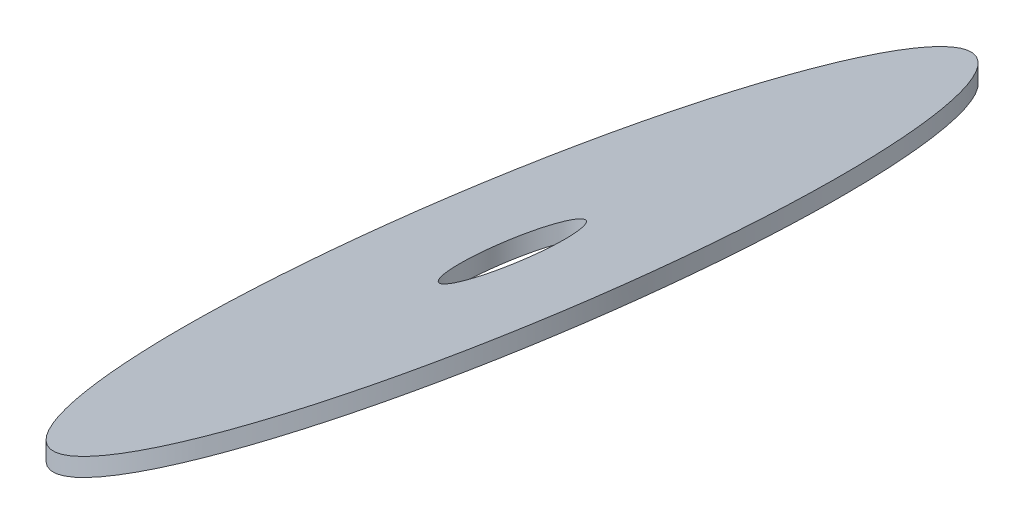
ISO-10303-21;
HEADER;
FILE_DESCRIPTION(('STEP AP214'),'2;1');
FILE_NAME('part.step','',(''),(''),'','','');
FILE_SCHEMA(('AUTOMOTIVE_DESIGN { 1 0 10303 214 1 1 1 1 }'));
ENDSEC;
DATA;
#1=APPLICATION_CONTEXT('core data for automotive mechanical design processes');
#2=APPLICATION_PROTOCOL_DEFINITION('international standard','automotive_design',2000,#1);
#3=PRODUCT_CONTEXT('',#1,'mechanical');
#4=PRODUCT('Part','Part','',(#3));
#5=PRODUCT_RELATED_PRODUCT_CATEGORY('part','',(#4));
#6=PRODUCT_DEFINITION_FORMATION('','',#4);
#7=PRODUCT_DEFINITION_CONTEXT('part definition',#1,'design');
#8=PRODUCT_DEFINITION('design','',#6,#7);
#9=PRODUCT_DEFINITION_SHAPE('','',#8);
#10=(LENGTH_UNIT() NAMED_UNIT(*) SI_UNIT(.MILLI.,.METRE.));
#11=(NAMED_UNIT(*) PLANE_ANGLE_UNIT() SI_UNIT($,.RADIAN.));
#12=(NAMED_UNIT(*) SI_UNIT($,.STERADIAN.) SOLID_ANGLE_UNIT());
#13=UNCERTAINTY_MEASURE_WITH_UNIT(LENGTH_MEASURE(1.E-05),#10,'distance_accuracy_value','');
#14=(GEOMETRIC_REPRESENTATION_CONTEXT(3) GLOBAL_UNCERTAINTY_ASSIGNED_CONTEXT((#13)) GLOBAL_UNIT_ASSIGNED_CONTEXT((#10,
#11,#12)) REPRESENTATION_CONTEXT('',''));
#15=CARTESIAN_POINT('',(0.,0.,0.));
#16=DIRECTION('',(0.,0.,1.));
#17=DIRECTION('',(1.,0.,0.));
#18=AXIS2_PLACEMENT_3D('',#15,#16,#17);
#19=CARTESIAN_POINT('',(-26.6210472318809,38.0135903569437,-151.690149136635));
#20=DIRECTION('',(0.573629133636462,-0.819115142726273,0.));
#21=DIRECTION('',(0.819115142726273,0.573629133636462,0.));
#22=AXIS2_PLACEMENT_3D('',#19,#20,#21);
#23=PLANE('',#22);
#24=CARTESIAN_POINT('',(24.8641144943987,74.068825055551,0.));
#25=DIRECTION('',(0.573629133636462,-0.819115142726273,0.));
#26=DIRECTION('',(-0.819115142726273,-0.573629133636462,0.));
#27=AXIS2_PLACEMENT_3D('',#24,#25,#26);
#28=ELLIPSE('',#27,8.5458070970362,7.);
#29=CARTESIAN_POINT('',(17.8641144943987,69.1667011342537,0.));
#30=VERTEX_POINT('',#29);
#31=EDGE_CURVE('E65',#30,#30,#28,.F.);
#32=ORIENTED_EDGE('',*,*,#31,.F.);
#33=EDGE_LOOP('',(#32));
#34=FACE_BOUND('',#33,.T.);
#35=CARTESIAN_POINT('',(24.834212463734,74.0478845612914,0.));
#36=DIRECTION('',(0.573629133636462,-0.819115142726273,0.));
#37=DIRECTION('',(-0.819115142726273,-0.573629133636462,0.));
#38=AXIS2_PLACEMENT_3D('',#35,#36,#37);
#39=ELLIPSE('',#38,53.7165017527989,44.);
#40=CARTESIAN_POINT('',(-19.1657875362659,43.2345341988519,0.));
#41=VERTEX_POINT('',#40);
#42=EDGE_CURVE('E61',#41,#41,#39,.F.);
#43=ORIENTED_EDGE('',*,*,#42,.T.);
#44=EDGE_LOOP('',(#43));
#45=FACE_BOUND('',#44,.T.);
#46=ADVANCED_FACE('F53',(#34,#45),#23,.F.);
#47=CARTESIAN_POINT('',(-25.4738406468606,36.3754338712918,-151.690149136635));
#48=DIRECTION('',(-0.573629133636462,0.819115142726272,0.));
#49=DIRECTION('',(-0.819115142726272,-0.573629133636462,0.));
#50=AXIS2_PLACEMENT_3D('',#47,#48,#49);
#51=PLANE('',#50);
#52=CARTESIAN_POINT('',(24.8641144943987,71.627275878028,0.));
#53=DIRECTION('',(-0.573629133636462,0.819115142726272,0.));
#54=DIRECTION('',(-0.819115142726272,-0.573629133636462,0.));
#55=AXIS2_PLACEMENT_3D('',#52,#53,#54);
#56=ELLIPSE('',#55,8.5458070970362,7.);
#57=CARTESIAN_POINT('',(17.8641144943987,66.7251519567308,0.));
#58=VERTEX_POINT('',#57);
#59=EDGE_CURVE('E57',#58,#58,#56,.F.);
#60=ORIENTED_EDGE('',*,*,#59,.F.);
#61=EDGE_LOOP('',(#60));
#62=FACE_BOUND('',#61,.T.);
#63=CARTESIAN_POINT('',(24.834212463734,71.6063353837685,0.));
#64=DIRECTION('',(-0.573629133636462,0.819115142726272,0.));
#65=DIRECTION('',(-0.819115142726272,-0.573629133636462,0.));
#66=AXIS2_PLACEMENT_3D('',#63,#64,#65);
#67=ELLIPSE('',#66,53.7165017527989,44.);
#68=CARTESIAN_POINT('',(-19.1657875362659,40.7929850213289,0.));
#69=VERTEX_POINT('',#68);
#70=EDGE_CURVE('E12',#69,#69,#67,.F.);
#71=ORIENTED_EDGE('',*,*,#70,.T.);
#72=EDGE_LOOP('',(#71));
#73=FACE_BOUND('',#72,.T.);
#74=ADVANCED_FACE('F55',(#62,#73),#51,.F.);
#75=CARTESIAN_POINT('',(24.834212463734,148.471380654833,0.));
#76=DIRECTION('',(0.,-1.,0.));
#77=DIRECTION('',(0.,0.,-1.));
#78=AXIS2_PLACEMENT_3D('',#75,#76,#77);
#79=CYLINDRICAL_SURFACE('',#78,44.);
#80=ORIENTED_EDGE('',*,*,#42,.F.);
#81=EDGE_LOOP('',(#80));
#82=FACE_BOUND('',#81,.T.);
#83=ORIENTED_EDGE('',*,*,#70,.F.);
#84=EDGE_LOOP('',(#83));
#85=FACE_BOUND('',#84,.T.);
#86=ADVANCED_FACE('F77',(#82,#85),#79,.T.);
#87=CARTESIAN_POINT('',(24.8641144943987,104.861234923731,0.));
#88=DIRECTION('',(0.,-1.,0.));
#89=DIRECTION('',(0.,0.,-1.));
#90=AXIS2_PLACEMENT_3D('',#87,#88,#89);
#91=CYLINDRICAL_SURFACE('',#90,7.);
#92=ORIENTED_EDGE('',*,*,#59,.T.);
#93=EDGE_LOOP('',(#92));
#94=FACE_BOUND('',#93,.T.);
#95=ORIENTED_EDGE('',*,*,#31,.T.);
#96=EDGE_LOOP('',(#95));
#97=FACE_BOUND('',#96,.T.);
#98=ADVANCED_FACE('F74',(#94,#97),#91,.F.);
#99=CLOSED_SHELL('',(#46,#74,#86,#98));
#100=MANIFOLD_SOLID_BREP('B2',#99);
#101=ADVANCED_BREP_SHAPE_REPRESENTATION('',(#18,#100),#14);
#102=SHAPE_DEFINITION_REPRESENTATION(#9,#101);
ENDSEC;
END-ISO-10303-21;
